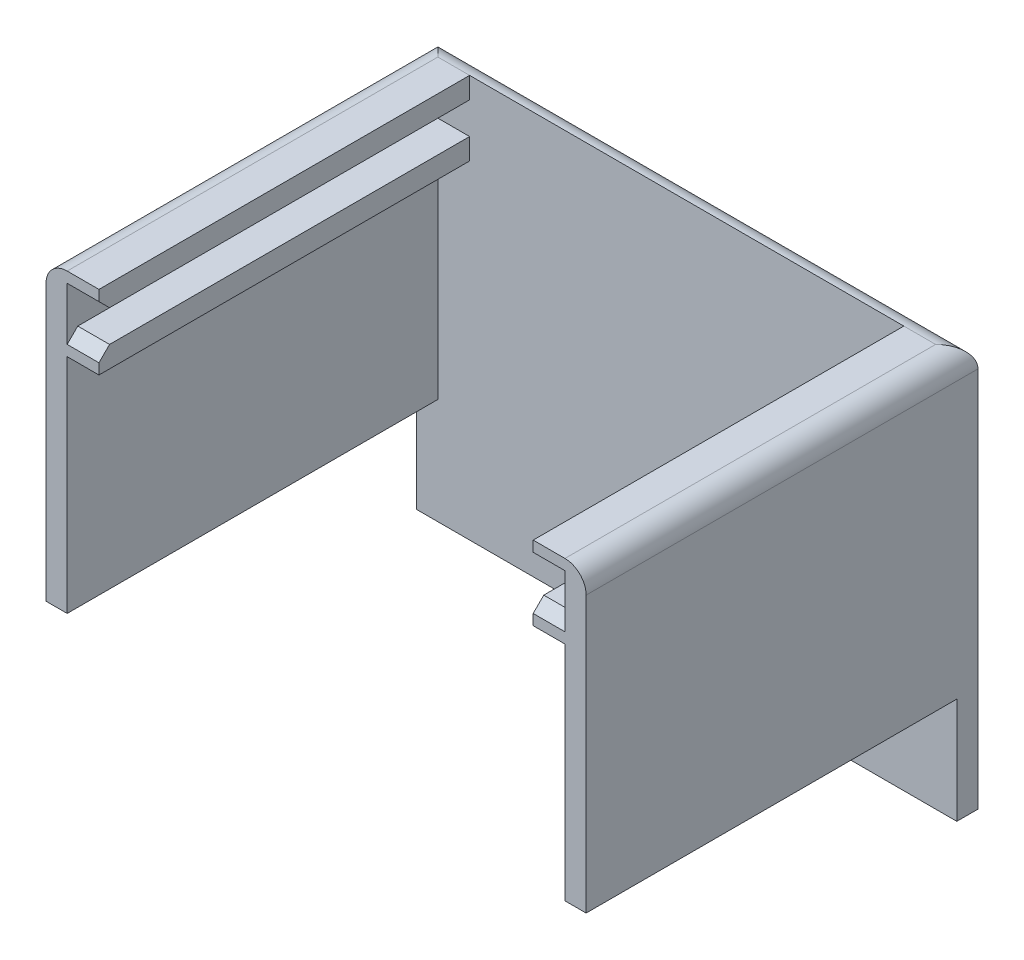
ISO-10303-21;
HEADER;
FILE_DESCRIPTION(('STEP AP214'),'2;1');
FILE_NAME('part.step','',(''),(''),'','','');
FILE_SCHEMA(('AUTOMOTIVE_DESIGN { 1 0 10303 214 1 1 1 1 }'));
ENDSEC;
DATA;
#1=APPLICATION_CONTEXT('core data for automotive mechanical design processes');
#2=APPLICATION_PROTOCOL_DEFINITION('international standard','automotive_design',2000,#1);
#3=PRODUCT_CONTEXT('',#1,'mechanical');
#4=PRODUCT('Part','Part','',(#3));
#5=PRODUCT_RELATED_PRODUCT_CATEGORY('part','',(#4));
#6=PRODUCT_DEFINITION_FORMATION('','',#4);
#7=PRODUCT_DEFINITION_CONTEXT('part definition',#1,'design');
#8=PRODUCT_DEFINITION('design','',#6,#7);
#9=PRODUCT_DEFINITION_SHAPE('','',#8);
#10=(LENGTH_UNIT() NAMED_UNIT(*) SI_UNIT(.MILLI.,.METRE.));
#11=(NAMED_UNIT(*) PLANE_ANGLE_UNIT() SI_UNIT($,.RADIAN.));
#12=(NAMED_UNIT(*) SI_UNIT($,.STERADIAN.) SOLID_ANGLE_UNIT());
#13=UNCERTAINTY_MEASURE_WITH_UNIT(LENGTH_MEASURE(1.E-05),#10,'distance_accuracy_value','');
#14=(GEOMETRIC_REPRESENTATION_CONTEXT(3) GLOBAL_UNCERTAINTY_ASSIGNED_CONTEXT((#13)) GLOBAL_UNIT_ASSIGNED_CONTEXT((#10,
#11,#12)) REPRESENTATION_CONTEXT('',''));
#15=CARTESIAN_POINT('',(0.,0.,0.));
#16=DIRECTION('',(0.,0.,1.));
#17=DIRECTION('',(1.,0.,0.));
#18=AXIS2_PLACEMENT_3D('',#15,#16,#17);
#19=CARTESIAN_POINT('',(-25.5,-2.,17.5));
#20=DIRECTION('',(0.,0.,-1.));
#21=DIRECTION('',(-1.,0.,0.));
#22=AXIS2_PLACEMENT_3D('',#19,#20,#21);
#23=PLANE('',#22);
#24=DIRECTION('',(0.,1.,0.));
#25=VECTOR('',#24,1.);
#26=CARTESIAN_POINT('',(-25.5,-2.,17.5));
#27=LINE('',#26,#25);
#28=CARTESIAN_POINT('',(-25.5,8.,17.5));
#29=VERTEX_POINT('',#28);
#30=CARTESIAN_POINT('',(-25.5,34.,17.5));
#31=VERTEX_POINT('',#30);
#32=EDGE_CURVE('E375',#29,#31,#27,.T.);
#33=ORIENTED_EDGE('',*,*,#32,.F.);
#34=DIRECTION('',(1.,0.,0.));
#35=VECTOR('',#34,1.);
#36=CARTESIAN_POINT('',(-25.5,8.,17.5));
#37=LINE('',#36,#35);
#38=CARTESIAN_POINT('',(-23.5,8.,17.5));
#39=VERTEX_POINT('',#38);
#40=EDGE_CURVE('E434',#29,#39,#37,.T.);
#41=ORIENTED_EDGE('',*,*,#40,.T.);
#42=DIRECTION('',(0.,-1.,0.));
#43=VECTOR('',#42,1.);
#44=CARTESIAN_POINT('',(-23.5,36.,17.5));
#45=LINE('',#44,#43);
#46=CARTESIAN_POINT('',(-23.5,29.,17.5));
#47=VERTEX_POINT('',#46);
#48=EDGE_CURVE('E266',#47,#39,#45,.T.);
#49=ORIENTED_EDGE('',*,*,#48,.F.);
#50=DIRECTION('',(1.,0.,0.));
#51=VECTOR('',#50,1.);
#52=CARTESIAN_POINT('',(-23.5,29.,17.5));
#53=LINE('',#52,#51);
#54=CARTESIAN_POINT('',(-20.5,29.,17.5));
#55=VERTEX_POINT('',#54);
#56=EDGE_CURVE('E403',#47,#55,#53,.T.);
#57=ORIENTED_EDGE('',*,*,#56,.T.);
#58=DIRECTION('',(0.,1.,0.));
#59=VECTOR('',#58,1.);
#60=CARTESIAN_POINT('',(-20.5,31.,17.5));
#61=LINE('',#60,#59);
#62=CARTESIAN_POINT('',(-20.5,30.,17.5));
#63=VERTEX_POINT('',#62);
#64=EDGE_CURVE('E392',#55,#63,#61,.T.);
#65=ORIENTED_EDGE('',*,*,#64,.T.);
#66=DIRECTION('',(-1.,0.,0.));
#67=VECTOR('',#66,1.);
#68=CARTESIAN_POINT('',(-23.5,30.,17.5));
#69=LINE('',#68,#67);
#70=CARTESIAN_POINT('',(-23.5,30.,17.5));
#71=VERTEX_POINT('',#70);
#72=EDGE_CURVE('E313',#63,#71,#69,.T.);
#73=ORIENTED_EDGE('',*,*,#72,.T.);
#74=CARTESIAN_POINT('',(-23.5,35.,17.5));
#75=VERTEX_POINT('',#74);
#76=EDGE_CURVE('E267',#75,#71,#45,.T.);
#77=ORIENTED_EDGE('',*,*,#76,.F.);
#78=DIRECTION('',(1.,0.,0.));
#79=VECTOR('',#78,1.);
#80=CARTESIAN_POINT('',(-25.5,35.,17.5));
#81=LINE('',#80,#79);
#82=CARTESIAN_POINT('',(-20.5,35.,17.5));
#83=VERTEX_POINT('',#82);
#84=EDGE_CURVE('E303',#75,#83,#81,.T.);
#85=ORIENTED_EDGE('',*,*,#84,.T.);
#86=DIRECTION('',(0.,-1.,0.));
#87=VECTOR('',#86,1.);
#88=CARTESIAN_POINT('',(-20.5,36.,17.5));
#89=LINE('',#88,#87);
#90=CARTESIAN_POINT('',(-20.5,36.,17.5));
#91=VERTEX_POINT('',#90);
#92=EDGE_CURVE('E250',#91,#83,#89,.T.);
#93=ORIENTED_EDGE('',*,*,#92,.F.);
#94=DIRECTION('',(-1.,0.,0.));
#95=VECTOR('',#94,1.);
#96=CARTESIAN_POINT('',(-25.5,36.,17.5));
#97=LINE('',#96,#95);
#98=CARTESIAN_POINT('',(-23.5,36.,17.5));
#99=VERTEX_POINT('',#98);
#100=EDGE_CURVE('E384',#91,#99,#97,.T.);
#101=ORIENTED_EDGE('',*,*,#100,.T.);
#102=CARTESIAN_POINT('',(-23.5,34.,17.5));
#103=DIRECTION('',(0.,0.,-1.));
#104=DIRECTION('',(-1.,0.,0.));
#105=AXIS2_PLACEMENT_3D('',#102,#103,#104);
#106=CIRCLE('',#105,2.);
#107=EDGE_CURVE('E294',#99,#31,#106,.F.);
#108=ORIENTED_EDGE('',*,*,#107,.T.);
#109=EDGE_LOOP('',(#33,#41,#49,#57,#65,#73,#77,#85,#93,#101,#108));
#110=FACE_BOUND('',#109,.T.);
#111=ADVANCED_FACE('F33',(#110),#23,.F.);
#112=CARTESIAN_POINT('',(0.,36.,0.));
#113=DIRECTION('',(0.,-1.,0.));
#114=DIRECTION('',(0.,0.,-1.));
#115=AXIS2_PLACEMENT_3D('',#112,#113,#114);
#116=PLANE('',#115);
#117=CARTESIAN_POINT('',(23.5,36.,17.5));
#118=VERTEX_POINT('',#117);
#119=CARTESIAN_POINT('',(20.5,36.,17.5));
#120=VERTEX_POINT('',#119);
#121=EDGE_CURVE('E380',#118,#120,#97,.T.);
#122=ORIENTED_EDGE('',*,*,#121,.F.);
#123=DIRECTION('',(0.,0.,-1.));
#124=VECTOR('',#123,1.);
#125=CARTESIAN_POINT('',(23.5,36.,0.));
#126=LINE('',#125,#124);
#127=CARTESIAN_POINT('',(23.5,36.,-17.5));
#128=VERTEX_POINT('',#127);
#129=EDGE_CURVE('E288',#118,#128,#126,.T.);
#130=ORIENTED_EDGE('',*,*,#129,.T.);
#131=DIRECTION('',(-1.,0.,0.));
#132=VECTOR('',#131,1.);
#133=CARTESIAN_POINT('',(0.,36.,-17.5));
#134=LINE('',#133,#132);
#135=CARTESIAN_POINT('',(20.5,36.,-17.5));
#136=VERTEX_POINT('',#135);
#137=EDGE_CURVE('E286',#128,#136,#134,.T.);
#138=ORIENTED_EDGE('',*,*,#137,.T.);
#139=DIRECTION('',(0.,0.,1.));
#140=VECTOR('',#139,1.);
#141=CARTESIAN_POINT('',(20.5,36.,19.5));
#142=LINE('',#141,#140);
#143=EDGE_CURVE('E372',#136,#120,#142,.T.);
#144=ORIENTED_EDGE('',*,*,#143,.T.);
#145=EDGE_LOOP('',(#122,#130,#138,#144));
#146=FACE_BOUND('',#145,.T.);
#147=ADVANCED_FACE('F529',(#146),#116,.F.);
#148=CARTESIAN_POINT('',(23.5,36.,-17.5));
#149=DIRECTION('',(-1.,0.,0.));
#150=DIRECTION('',(0.,0.,1.));
#151=AXIS2_PLACEMENT_3D('',#148,#149,#150);
#152=PLANE('',#151);
#153=DIRECTION('',(0.,0.,-1.));
#154=VECTOR('',#153,1.);
#155=CARTESIAN_POINT('',(23.5,8.,-17.5));
#156=LINE('',#155,#154);
#157=CARTESIAN_POINT('',(23.5,8.,17.5));
#158=VERTEX_POINT('',#157);
#159=CARTESIAN_POINT('',(23.5,8.,-17.5));
#160=VERTEX_POINT('',#159);
#161=EDGE_CURVE('E307',#158,#160,#156,.T.);
#162=ORIENTED_EDGE('',*,*,#161,.F.);
#163=DIRECTION('',(0.,-1.,0.));
#164=VECTOR('',#163,1.);
#165=CARTESIAN_POINT('',(23.5,36.,17.5));
#166=LINE('',#165,#164);
#167=CARTESIAN_POINT('',(23.5,29.,17.5));
#168=VERTEX_POINT('',#167);
#169=EDGE_CURVE('E263',#168,#158,#166,.T.);
#170=ORIENTED_EDGE('',*,*,#169,.F.);
#171=DIRECTION('',(0.,0.,1.));
#172=VECTOR('',#171,1.);
#173=CARTESIAN_POINT('',(23.5,29.,-21.105551275464));
#174=LINE('',#173,#172);
#175=CARTESIAN_POINT('',(23.5,29.,-17.5));
#176=VERTEX_POINT('',#175);
#177=EDGE_CURVE('E422',#176,#168,#174,.T.);
#178=ORIENTED_EDGE('',*,*,#177,.F.);
#179=DIRECTION('',(0.,-1.,0.));
#180=VECTOR('',#179,1.);
#181=CARTESIAN_POINT('',(23.5,36.,-17.5));
#182=LINE('',#181,#180);
#183=EDGE_CURVE('E259',#176,#160,#182,.T.);
#184=ORIENTED_EDGE('',*,*,#183,.T.);
#185=EDGE_LOOP('',(#162,#170,#178,#184));
#186=FACE_BOUND('',#185,.T.);
#187=ADVANCED_FACE('F464',(#186),#152,.T.);
#188=CARTESIAN_POINT('',(-23.5,36.,-17.5));
#189=DIRECTION('',(1.,0.,0.));
#190=DIRECTION('',(0.,0.,-1.));
#191=AXIS2_PLACEMENT_3D('',#188,#189,#190);
#192=PLANE('',#191);
#193=DIRECTION('',(0.,0.,1.));
#194=VECTOR('',#193,1.);
#195=CARTESIAN_POINT('',(-23.5,31.,-21.105551275464));
#196=LINE('',#195,#194);
#197=CARTESIAN_POINT('',(-23.5,31.,-17.5));
#198=VERTEX_POINT('',#197);
#199=CARTESIAN_POINT('',(-23.5,31.,16.5));
#200=VERTEX_POINT('',#199);
#201=EDGE_CURVE('E397',#198,#200,#196,.T.);
#202=ORIENTED_EDGE('',*,*,#201,.F.);
#203=DIRECTION('',(0.,-1.,0.));
#204=VECTOR('',#203,1.);
#205=CARTESIAN_POINT('',(-23.5,36.,-17.5));
#206=LINE('',#205,#204);
#207=CARTESIAN_POINT('',(-23.5,34.,-17.5));
#208=VERTEX_POINT('',#207);
#209=EDGE_CURVE('E256',#208,#198,#206,.T.);
#210=ORIENTED_EDGE('',*,*,#209,.F.);
#211=DIRECTION('',(0.,0.,1.));
#212=VECTOR('',#211,1.);
#213=CARTESIAN_POINT('',(-23.5,34.,-17.5));
#214=LINE('',#213,#212);
#215=CARTESIAN_POINT('',(-23.5,34.,16.5));
#216=VERTEX_POINT('',#215);
#217=EDGE_CURVE('E350',#208,#216,#214,.T.);
#218=ORIENTED_EDGE('',*,*,#217,.T.);
#219=DIRECTION('',(0.,-0.707106781186545,-0.70710678118655));
#220=VECTOR('',#219,1.);
#221=CARTESIAN_POINT('',(-23.5,35.,17.5));
#222=LINE('',#221,#220);
#223=EDGE_CURVE('E41',#216,#75,#222,.F.);
#224=ORIENTED_EDGE('',*,*,#223,.T.);
#225=ORIENTED_EDGE('',*,*,#76,.T.);
#226=DIRECTION('',(0.,0.707106781186544,-0.707106781186551));
#227=VECTOR('',#226,1.);
#228=CARTESIAN_POINT('',(-23.5,30.,17.5));
#229=LINE('',#228,#227);
#230=EDGE_CURVE('E342',#71,#200,#229,.T.);
#231=ORIENTED_EDGE('',*,*,#230,.T.);
#232=EDGE_LOOP('',(#202,#210,#218,#224,#225,#231));
#233=FACE_BOUND('',#232,.T.);
#234=ADVANCED_FACE('F347',(#233),#192,.T.);
#235=DIRECTION('',(0.,0.,1.));
#236=VECTOR('',#235,1.);
#237=CARTESIAN_POINT('',(23.5,31.,-21.105551275464));
#238=LINE('',#237,#236);
#239=CARTESIAN_POINT('',(23.5,31.,-17.5));
#240=VERTEX_POINT('',#239);
#241=CARTESIAN_POINT('',(23.5,31.,16.5));
#242=VERTEX_POINT('',#241);
#243=EDGE_CURVE('E412',#240,#242,#238,.T.);
#244=ORIENTED_EDGE('',*,*,#243,.T.);
#245=DIRECTION('',(0.,-0.707106781186544,0.707106781186551));
#246=VECTOR('',#245,1.);
#247=CARTESIAN_POINT('',(23.5,30.,17.5));
#248=LINE('',#247,#246);
#249=CARTESIAN_POINT('',(23.5,30.,17.5));
#250=VERTEX_POINT('',#249);
#251=EDGE_CURVE('E337',#242,#250,#248,.T.);
#252=ORIENTED_EDGE('',*,*,#251,.T.);
#253=CARTESIAN_POINT('',(23.5,35.,17.5));
#254=VERTEX_POINT('',#253);
#255=EDGE_CURVE('E264',#254,#250,#166,.T.);
#256=ORIENTED_EDGE('',*,*,#255,.F.);
#257=DIRECTION('',(0.,0.707106781186543,0.707106781186552));
#258=VECTOR('',#257,1.);
#259=CARTESIAN_POINT('',(23.5,35.,17.5));
#260=LINE('',#259,#258);
#261=CARTESIAN_POINT('',(23.5,34.,16.5));
#262=VERTEX_POINT('',#261);
#263=EDGE_CURVE('E340',#254,#262,#260,.F.);
#264=ORIENTED_EDGE('',*,*,#263,.T.);
#265=DIRECTION('',(0.,0.,-1.));
#266=VECTOR('',#265,1.);
#267=CARTESIAN_POINT('',(23.5,34.,-17.5));
#268=LINE('',#267,#266);
#269=CARTESIAN_POINT('',(23.5,34.,-17.5));
#270=VERTEX_POINT('',#269);
#271=EDGE_CURVE('E369',#262,#270,#268,.T.);
#272=ORIENTED_EDGE('',*,*,#271,.T.);
#273=EDGE_CURVE('E260',#270,#240,#182,.T.);
#274=ORIENTED_EDGE('',*,*,#273,.T.);
#275=EDGE_LOOP('',(#244,#252,#256,#264,#272,#274));
#276=FACE_BOUND('',#275,.T.);
#277=ADVANCED_FACE('F481',(#276),#152,.T.);
#278=DIRECTION('',(0.,0.,1.));
#279=VECTOR('',#278,1.);
#280=CARTESIAN_POINT('',(-23.5,8.,-17.5));
#281=LINE('',#280,#279);
#282=CARTESIAN_POINT('',(-23.5,8.,-17.5));
#283=VERTEX_POINT('',#282);
#284=EDGE_CURVE('E433',#283,#39,#281,.T.);
#285=ORIENTED_EDGE('',*,*,#284,.F.);
#286=CARTESIAN_POINT('',(-23.5,29.,-17.5));
#287=VERTEX_POINT('',#286);
#288=EDGE_CURVE('E255',#287,#283,#206,.T.);
#289=ORIENTED_EDGE('',*,*,#288,.F.);
#290=DIRECTION('',(0.,0.,1.));
#291=VECTOR('',#290,1.);
#292=CARTESIAN_POINT('',(-23.5,29.,-21.105551275464));
#293=LINE('',#292,#291);
#294=EDGE_CURVE('E388',#287,#47,#293,.T.);
#295=ORIENTED_EDGE('',*,*,#294,.T.);
#296=ORIENTED_EDGE('',*,*,#48,.T.);
#297=EDGE_LOOP('',(#285,#289,#295,#296));
#298=FACE_BOUND('',#297,.T.);
#299=ADVANCED_FACE('F563',(#298),#192,.T.);
#300=DIRECTION('',(0.,0.,-1.));
#301=VECTOR('',#300,1.);
#302=CARTESIAN_POINT('',(-20.5,36.,-19.5));
#303=LINE('',#302,#301);
#304=CARTESIAN_POINT('',(-20.5,36.,-17.5));
#305=VERTEX_POINT('',#304);
#306=EDGE_CURVE('E361',#91,#305,#303,.T.);
#307=ORIENTED_EDGE('',*,*,#306,.T.);
#308=DIRECTION('',(-1.,0.,0.));
#309=VECTOR('',#308,1.);
#310=CARTESIAN_POINT('',(0.,36.,-17.5));
#311=LINE('',#310,#309);
#312=CARTESIAN_POINT('',(-23.5,36.,-17.5));
#313=VERTEX_POINT('',#312);
#314=EDGE_CURVE('E284',#305,#313,#311,.T.);
#315=ORIENTED_EDGE('',*,*,#314,.T.);
#316=DIRECTION('',(0.,0.,1.));
#317=VECTOR('',#316,1.);
#318=CARTESIAN_POINT('',(-23.5,36.,0.));
#319=LINE('',#318,#317);
#320=EDGE_CURVE('E282',#313,#99,#319,.T.);
#321=ORIENTED_EDGE('',*,*,#320,.T.);
#322=ORIENTED_EDGE('',*,*,#100,.F.);
#323=EDGE_LOOP('',(#307,#315,#321,#322));
#324=FACE_BOUND('',#323,.T.);
#325=ADVANCED_FACE('F510',(#324),#116,.F.);
#326=CARTESIAN_POINT('',(25.5,36.,-19.5));
#327=DIRECTION('',(-1.,0.,0.));
#328=DIRECTION('',(0.,0.,1.));
#329=AXIS2_PLACEMENT_3D('',#326,#327,#328);
#330=PLANE('',#329);
#331=DIRECTION('',(0.,1.,0.));
#332=VECTOR('',#331,1.);
#333=CARTESIAN_POINT('',(25.5,-2.,17.5));
#334=LINE('',#333,#332);
#335=CARTESIAN_POINT('',(25.5,8.,17.5));
#336=VERTEX_POINT('',#335);
#337=CARTESIAN_POINT('',(25.5,34.,17.5));
#338=VERTEX_POINT('',#337);
#339=EDGE_CURVE('E378',#336,#338,#334,.T.);
#340=ORIENTED_EDGE('',*,*,#339,.F.);
#341=DIRECTION('',(0.,0.,1.));
#342=VECTOR('',#341,1.);
#343=CARTESIAN_POINT('',(25.5,8.,17.5));
#344=LINE('',#343,#342);
#345=CARTESIAN_POINT('',(25.5,8.,-17.5));
#346=VERTEX_POINT('',#345);
#347=EDGE_CURVE('E48',#346,#336,#344,.T.);
#348=ORIENTED_EDGE('',*,*,#347,.F.);
#349=DIRECTION('',(0.,1.,0.));
#350=VECTOR('',#349,1.);
#351=CARTESIAN_POINT('',(25.5,-2.,-17.5));
#352=LINE('',#351,#350);
#353=CARTESIAN_POINT('',(25.5,-2.,-17.5));
#354=VERTEX_POINT('',#353);
#355=EDGE_CURVE('E440',#354,#346,#352,.T.);
#356=ORIENTED_EDGE('',*,*,#355,.F.);
#357=DIRECTION('',(0.,0.,1.));
#358=VECTOR('',#357,1.);
#359=CARTESIAN_POINT('',(25.5,-2.,-19.5));
#360=LINE('',#359,#358);
#361=CARTESIAN_POINT('',(25.5,-2.,-19.5));
#362=VERTEX_POINT('',#361);
#363=EDGE_CURVE('E239',#362,#354,#360,.T.);
#364=ORIENTED_EDGE('',*,*,#363,.F.);
#365=DIRECTION('',(0.,-1.,0.));
#366=VECTOR('',#365,1.);
#367=CARTESIAN_POINT('',(25.5,36.,-19.5));
#368=LINE('',#367,#366);
#369=CARTESIAN_POINT('',(25.5,34.,-19.5));
#370=VERTEX_POINT('',#369);
#371=EDGE_CURVE('E270',#370,#362,#368,.T.);
#372=ORIENTED_EDGE('',*,*,#371,.F.);
#373=DIRECTION('',(0.,0.,-1.));
#374=VECTOR('',#373,1.);
#375=CARTESIAN_POINT('',(25.5,34.,-19.5));
#376=LINE('',#375,#374);
#377=EDGE_CURVE('E291',#370,#338,#376,.F.);
#378=ORIENTED_EDGE('',*,*,#377,.T.);
#379=EDGE_LOOP('',(#340,#348,#356,#364,#372,#378));
#380=FACE_BOUND('',#379,.T.);
#381=ADVANCED_FACE('F456',(#380),#330,.F.);
#382=CARTESIAN_POINT('',(25.5,36.,-19.5));
#383=DIRECTION('',(0.,0.,1.));
#384=DIRECTION('',(1.,0.,0.));
#385=AXIS2_PLACEMENT_3D('',#382,#383,#384);
#386=PLANE('',#385);
#387=DIRECTION('',(0.,-1.,0.));
#388=VECTOR('',#387,1.);
#389=CARTESIAN_POINT('',(-25.5,36.,-19.5));
#390=LINE('',#389,#388);
#391=CARTESIAN_POINT('',(-25.5,34.,-19.5));
#392=VERTEX_POINT('',#391);
#393=CARTESIAN_POINT('',(-25.5,-2.,-19.5));
#394=VERTEX_POINT('',#393);
#395=EDGE_CURVE('E244',#392,#394,#390,.T.);
#396=ORIENTED_EDGE('',*,*,#395,.F.);
#397=DIRECTION('',(-1.,0.,0.));
#398=VECTOR('',#397,1.);
#399=CARTESIAN_POINT('',(25.5,34.,-19.5));
#400=LINE('',#399,#398);
#401=EDGE_CURVE('E299',#392,#370,#400,.F.);
#402=ORIENTED_EDGE('',*,*,#401,.T.);
#403=ORIENTED_EDGE('',*,*,#371,.T.);
#404=DIRECTION('',(1.,0.,0.));
#405=VECTOR('',#404,1.);
#406=CARTESIAN_POINT('',(-25.5,-2.,-19.5));
#407=LINE('',#406,#405);
#408=EDGE_CURVE('E246',#394,#362,#407,.T.);
#409=ORIENTED_EDGE('',*,*,#408,.F.);
#410=EDGE_LOOP('',(#396,#402,#403,#409));
#411=FACE_BOUND('',#410,.T.);
#412=ADVANCED_FACE('F452',(#411),#386,.F.);
#413=CARTESIAN_POINT('',(-25.5,36.,-19.5));
#414=DIRECTION('',(1.,0.,0.));
#415=DIRECTION('',(0.,0.,-1.));
#416=AXIS2_PLACEMENT_3D('',#413,#414,#415);
#417=PLANE('',#416);
#418=DIRECTION('',(0.,1.,0.));
#419=VECTOR('',#418,1.);
#420=CARTESIAN_POINT('',(-25.5,-2.,-17.5));
#421=LINE('',#420,#419);
#422=CARTESIAN_POINT('',(-25.5,-2.,-17.5));
#423=VERTEX_POINT('',#422);
#424=CARTESIAN_POINT('',(-25.5,8.,-17.5));
#425=VERTEX_POINT('',#424);
#426=EDGE_CURVE('E218',#423,#425,#421,.T.);
#427=ORIENTED_EDGE('',*,*,#426,.T.);
#428=DIRECTION('',(0.,0.,1.));
#429=VECTOR('',#428,1.);
#430=CARTESIAN_POINT('',(-25.5,8.,17.5));
#431=LINE('',#430,#429);
#432=EDGE_CURVE('E230',#425,#29,#431,.T.);
#433=ORIENTED_EDGE('',*,*,#432,.T.);
#434=ORIENTED_EDGE('',*,*,#32,.T.);
#435=DIRECTION('',(0.,0.,1.));
#436=VECTOR('',#435,1.);
#437=CARTESIAN_POINT('',(-25.5,34.,-19.5));
#438=LINE('',#437,#436);
#439=EDGE_CURVE('E301',#31,#392,#438,.F.);
#440=ORIENTED_EDGE('',*,*,#439,.T.);
#441=ORIENTED_EDGE('',*,*,#395,.T.);
#442=DIRECTION('',(0.,0.,-1.));
#443=VECTOR('',#442,1.);
#444=CARTESIAN_POINT('',(-25.5,-2.,-19.5));
#445=LINE('',#444,#443);
#446=EDGE_CURVE('E236',#423,#394,#445,.T.);
#447=ORIENTED_EDGE('',*,*,#446,.F.);
#448=EDGE_LOOP('',(#427,#433,#434,#440,#441,#447));
#449=FACE_BOUND('',#448,.T.);
#450=ADVANCED_FACE('F242',(#449),#417,.F.);
#451=CARTESIAN_POINT('',(23.5,36.,-17.5));
#452=DIRECTION('',(0.,0.,1.));
#453=DIRECTION('',(1.,0.,0.));
#454=AXIS2_PLACEMENT_3D('',#451,#452,#453);
#455=PLANE('',#454);
#456=ORIENTED_EDGE('',*,*,#288,.T.);
#457=DIRECTION('',(1.,0.,0.));
#458=VECTOR('',#457,1.);
#459=CARTESIAN_POINT('',(-25.5,8.,-17.5));
#460=LINE('',#459,#458);
#461=EDGE_CURVE('E225',#425,#283,#460,.T.);
#462=ORIENTED_EDGE('',*,*,#461,.F.);
#463=ORIENTED_EDGE('',*,*,#426,.F.);
#464=DIRECTION('',(1.,0.,0.));
#465=VECTOR('',#464,1.);
#466=CARTESIAN_POINT('',(-25.5,-2.,-17.5));
#467=LINE('',#466,#465);
#468=EDGE_CURVE('E223',#423,#354,#467,.T.);
#469=ORIENTED_EDGE('',*,*,#468,.T.);
#470=ORIENTED_EDGE('',*,*,#355,.T.);
#471=EDGE_CURVE('E240',#160,#346,#460,.T.);
#472=ORIENTED_EDGE('',*,*,#471,.F.);
#473=ORIENTED_EDGE('',*,*,#183,.F.);
#474=DIRECTION('',(-1.,0.,0.));
#475=VECTOR('',#474,1.);
#476=CARTESIAN_POINT('',(20.5,29.,-17.5));
#477=LINE('',#476,#475);
#478=CARTESIAN_POINT('',(20.5,29.,-17.5));
#479=VERTEX_POINT('',#478);
#480=EDGE_CURVE('E411',#176,#479,#477,.T.);
#481=ORIENTED_EDGE('',*,*,#480,.T.);
#482=DIRECTION('',(0.,1.,0.));
#483=VECTOR('',#482,1.);
#484=CARTESIAN_POINT('',(20.5,31.,-17.5));
#485=LINE('',#484,#483);
#486=CARTESIAN_POINT('',(20.5,31.,-17.5));
#487=VERTEX_POINT('',#486);
#488=EDGE_CURVE('E425',#479,#487,#485,.T.);
#489=ORIENTED_EDGE('',*,*,#488,.T.);
#490=DIRECTION('',(1.,0.,0.));
#491=VECTOR('',#490,1.);
#492=CARTESIAN_POINT('',(20.5,31.,-17.5));
#493=LINE('',#492,#491);
#494=EDGE_CURVE('E406',#487,#240,#493,.T.);
#495=ORIENTED_EDGE('',*,*,#494,.T.);
#496=ORIENTED_EDGE('',*,*,#273,.F.);
#497=DIRECTION('',(-1.,0.,0.));
#498=VECTOR('',#497,1.);
#499=CARTESIAN_POINT('',(23.5,34.,-17.5));
#500=LINE('',#499,#498);
#501=CARTESIAN_POINT('',(20.5,34.,-17.5));
#502=VERTEX_POINT('',#501);
#503=EDGE_CURVE('E277',#270,#502,#500,.T.);
#504=ORIENTED_EDGE('',*,*,#503,.T.);
#505=DIRECTION('',(0.,-1.,0.));
#506=VECTOR('',#505,1.);
#507=CARTESIAN_POINT('',(20.5,36.,-17.5));
#508=LINE('',#507,#506);
#509=EDGE_CURVE('E279',#136,#502,#508,.T.);
#510=ORIENTED_EDGE('',*,*,#509,.F.);
#511=DIRECTION('',(-1.,0.,0.));
#512=VECTOR('',#511,1.);
#513=CARTESIAN_POINT('',(23.5,36.,-17.5));
#514=LINE('',#513,#512);
#515=EDGE_CURVE('E248',#136,#305,#514,.T.);
#516=ORIENTED_EDGE('',*,*,#515,.T.);
#517=DIRECTION('',(0.,1.,0.));
#518=VECTOR('',#517,1.);
#519=CARTESIAN_POINT('',(-20.5,36.,-17.5));
#520=LINE('',#519,#518);
#521=CARTESIAN_POINT('',(-20.5,34.,-17.5));
#522=VERTEX_POINT('',#521);
#523=EDGE_CURVE('E274',#522,#305,#520,.T.);
#524=ORIENTED_EDGE('',*,*,#523,.F.);
#525=DIRECTION('',(-1.,0.,0.));
#526=VECTOR('',#525,1.);
#527=CARTESIAN_POINT('',(23.5,34.,-17.5));
#528=LINE('',#527,#526);
#529=EDGE_CURVE('E272',#522,#208,#528,.T.);
#530=ORIENTED_EDGE('',*,*,#529,.T.);
#531=ORIENTED_EDGE('',*,*,#209,.T.);
#532=DIRECTION('',(1.,0.,0.));
#533=VECTOR('',#532,1.);
#534=CARTESIAN_POINT('',(-23.5,31.,-17.5));
#535=LINE('',#534,#533);
#536=CARTESIAN_POINT('',(-20.5,31.,-17.5));
#537=VERTEX_POINT('',#536);
#538=EDGE_CURVE('E387',#198,#537,#535,.T.);
#539=ORIENTED_EDGE('',*,*,#538,.T.);
#540=DIRECTION('',(0.,-1.,0.));
#541=VECTOR('',#540,1.);
#542=CARTESIAN_POINT('',(-20.5,31.,-17.5));
#543=LINE('',#542,#541);
#544=CARTESIAN_POINT('',(-20.5,29.,-17.5));
#545=VERTEX_POINT('',#544);
#546=EDGE_CURVE('E400',#537,#545,#543,.T.);
#547=ORIENTED_EDGE('',*,*,#546,.T.);
#548=DIRECTION('',(-1.,0.,0.));
#549=VECTOR('',#548,1.);
#550=CARTESIAN_POINT('',(-23.5,29.,-17.5));
#551=LINE('',#550,#549);
#552=EDGE_CURVE('E385',#545,#287,#551,.T.);
#553=ORIENTED_EDGE('',*,*,#552,.T.);
#554=EDGE_LOOP('',(#456,#462,#463,#469,#470,#472,#473,#481,#489,#495,#496,#504,#510,#516,#524,
#530,#531,#539,#547,#553));
#555=FACE_BOUND('',#554,.T.);
#556=ADVANCED_FACE('F221',(#555),#455,.T.);
#557=CARTESIAN_POINT('',(0.,-2.,0.));
#558=DIRECTION('',(0.,1.,0.));
#559=DIRECTION('',(0.,0.,1.));
#560=AXIS2_PLACEMENT_3D('',#557,#558,#559);
#561=PLANE('',#560);
#562=ORIENTED_EDGE('',*,*,#363,.T.);
#563=ORIENTED_EDGE('',*,*,#468,.F.);
#564=ORIENTED_EDGE('',*,*,#446,.T.);
#565=ORIENTED_EDGE('',*,*,#408,.T.);
#566=EDGE_LOOP('',(#562,#563,#564,#565));
#567=FACE_BOUND('',#566,.T.);
#568=ADVANCED_FACE('F234',(#567),#561,.F.);
#569=CARTESIAN_POINT('',(-20.5,34.,-19.5));
#570=DIRECTION('',(1.,0.,0.));
#571=DIRECTION('',(0.,0.,-1.));
#572=AXIS2_PLACEMENT_3D('',#569,#570,#571);
#573=PLANE('',#572);
#574=ORIENTED_EDGE('',*,*,#92,.T.);
#575=DIRECTION('',(0.,0.707106781186545,0.70710678118655));
#576=VECTOR('',#575,1.);
#577=CARTESIAN_POINT('',(-20.5,16.,-1.50000000000012));
#578=LINE('',#577,#576);
#579=CARTESIAN_POINT('',(-20.5,34.,16.5));
#580=VERTEX_POINT('',#579);
#581=EDGE_CURVE('E334',#83,#580,#578,.F.);
#582=ORIENTED_EDGE('',*,*,#581,.T.);
#583=DIRECTION('',(0.,0.,-1.));
#584=VECTOR('',#583,1.);
#585=CARTESIAN_POINT('',(-20.5,34.,-19.5));
#586=LINE('',#585,#584);
#587=EDGE_CURVE('E362',#580,#522,#586,.T.);
#588=ORIENTED_EDGE('',*,*,#587,.T.);
#589=ORIENTED_EDGE('',*,*,#523,.T.);
#590=ORIENTED_EDGE('',*,*,#306,.F.);
#591=EDGE_LOOP('',(#574,#582,#588,#589,#590));
#592=FACE_BOUND('',#591,.T.);
#593=ADVANCED_FACE('F359',(#592),#573,.T.);
#594=CARTESIAN_POINT('',(0.,34.,0.));
#595=DIRECTION('',(0.,1.,0.));
#596=DIRECTION('',(0.,0.,1.));
#597=AXIS2_PLACEMENT_3D('',#594,#595,#596);
#598=PLANE('',#597);
#599=ORIENTED_EDGE('',*,*,#587,.F.);
#600=DIRECTION('',(-1.,0.,0.));
#601=VECTOR('',#600,1.);
#602=CARTESIAN_POINT('',(0.,34.,16.5));
#603=LINE('',#602,#601);
#604=EDGE_CURVE('E55',#580,#216,#603,.T.);
#605=ORIENTED_EDGE('',*,*,#604,.T.);
#606=ORIENTED_EDGE('',*,*,#217,.F.);
#607=ORIENTED_EDGE('',*,*,#529,.F.);
#608=EDGE_LOOP('',(#599,#605,#606,#607));
#609=FACE_BOUND('',#608,.T.);
#610=ADVANCED_FACE('F550',(#609),#598,.F.);
#611=CARTESIAN_POINT('',(20.5,34.,19.5));
#612=DIRECTION('',(-1.,0.,0.));
#613=DIRECTION('',(0.,0.,1.));
#614=AXIS2_PLACEMENT_3D('',#611,#612,#613);
#615=PLANE('',#614);
#616=DIRECTION('',(0.,0.,1.));
#617=VECTOR('',#616,1.);
#618=CARTESIAN_POINT('',(20.5,34.,19.5));
#619=LINE('',#618,#617);
#620=CARTESIAN_POINT('',(20.5,34.,16.5));
#621=VERTEX_POINT('',#620);
#622=EDGE_CURVE('E371',#502,#621,#619,.T.);
#623=ORIENTED_EDGE('',*,*,#622,.T.);
#624=DIRECTION('',(0.,-0.707106781186543,-0.707106781186552));
#625=VECTOR('',#624,1.);
#626=CARTESIAN_POINT('',(20.5,35.5,18.));
#627=LINE('',#626,#625);
#628=CARTESIAN_POINT('',(20.5,35.,17.5));
#629=VERTEX_POINT('',#628);
#630=EDGE_CURVE('E328',#621,#629,#627,.F.);
#631=ORIENTED_EDGE('',*,*,#630,.T.);
#632=DIRECTION('',(0.,1.,0.));
#633=VECTOR('',#632,1.);
#634=CARTESIAN_POINT('',(20.5,36.,17.5));
#635=LINE('',#634,#633);
#636=EDGE_CURVE('E366',#629,#120,#635,.T.);
#637=ORIENTED_EDGE('',*,*,#636,.T.);
#638=ORIENTED_EDGE('',*,*,#143,.F.);
#639=ORIENTED_EDGE('',*,*,#509,.T.);
#640=EDGE_LOOP('',(#623,#631,#637,#638,#639));
#641=FACE_BOUND('',#640,.T.);
#642=ADVANCED_FACE('F500',(#641),#615,.T.);
#643=CARTESIAN_POINT('',(0.,34.,0.));
#644=DIRECTION('',(0.,1.,0.));
#645=DIRECTION('',(0.,0.,1.));
#646=AXIS2_PLACEMENT_3D('',#643,#644,#645);
#647=PLANE('',#646);
#648=ORIENTED_EDGE('',*,*,#271,.F.);
#649=DIRECTION('',(-1.,0.,0.));
#650=VECTOR('',#649,1.);
#651=CARTESIAN_POINT('',(0.,34.,16.5));
#652=LINE('',#651,#650);
#653=EDGE_CURVE('E326',#262,#621,#652,.T.);
#654=ORIENTED_EDGE('',*,*,#653,.T.);
#655=ORIENTED_EDGE('',*,*,#622,.F.);
#656=ORIENTED_EDGE('',*,*,#503,.F.);
#657=EDGE_LOOP('',(#648,#654,#655,#656));
#658=FACE_BOUND('',#657,.T.);
#659=ADVANCED_FACE('F497',(#658),#647,.F.);
#660=ORIENTED_EDGE('',*,*,#169,.T.);
#661=DIRECTION('',(1.,0.,0.));
#662=VECTOR('',#661,1.);
#663=CARTESIAN_POINT('',(-25.5,8.,17.5));
#664=LINE('',#663,#662);
#665=EDGE_CURVE('E11',#158,#336,#664,.T.);
#666=ORIENTED_EDGE('',*,*,#665,.T.);
#667=ORIENTED_EDGE('',*,*,#339,.T.);
#668=CARTESIAN_POINT('',(23.5,34.,17.5));
#669=DIRECTION('',(0.,0.,-1.));
#670=DIRECTION('',(-1.,0.,0.));
#671=AXIS2_PLACEMENT_3D('',#668,#669,#670);
#672=CIRCLE('',#671,2.);
#673=EDGE_CURVE('E297',#338,#118,#672,.F.);
#674=ORIENTED_EDGE('',*,*,#673,.T.);
#675=ORIENTED_EDGE('',*,*,#121,.T.);
#676=ORIENTED_EDGE('',*,*,#636,.F.);
#677=DIRECTION('',(1.,0.,0.));
#678=VECTOR('',#677,1.);
#679=CARTESIAN_POINT('',(-25.5,35.,17.5));
#680=LINE('',#679,#678);
#681=EDGE_CURVE('E316',#629,#254,#680,.T.);
#682=ORIENTED_EDGE('',*,*,#681,.T.);
#683=ORIENTED_EDGE('',*,*,#255,.T.);
#684=DIRECTION('',(-1.,0.,0.));
#685=VECTOR('',#684,1.);
#686=CARTESIAN_POINT('',(20.5,30.,17.5));
#687=LINE('',#686,#685);
#688=CARTESIAN_POINT('',(20.5,30.,17.5));
#689=VERTEX_POINT('',#688);
#690=EDGE_CURVE('E319',#250,#689,#687,.T.);
#691=ORIENTED_EDGE('',*,*,#690,.T.);
#692=DIRECTION('',(0.,-1.,0.));
#693=VECTOR('',#692,1.);
#694=CARTESIAN_POINT('',(20.5,31.,17.5));
#695=LINE('',#694,#693);
#696=CARTESIAN_POINT('',(20.5,29.,17.5));
#697=VERTEX_POINT('',#696);
#698=EDGE_CURVE('E310',#689,#697,#695,.T.);
#699=ORIENTED_EDGE('',*,*,#698,.T.);
#700=DIRECTION('',(1.,0.,0.));
#701=VECTOR('',#700,1.);
#702=CARTESIAN_POINT('',(20.5,29.,17.5));
#703=LINE('',#702,#701);
#704=EDGE_CURVE('E416',#697,#168,#703,.T.);
#705=ORIENTED_EDGE('',*,*,#704,.T.);
#706=EDGE_LOOP('',(#660,#666,#667,#674,#675,#676,#682,#683,#691,#699,#705));
#707=FACE_BOUND('',#706,.T.);
#708=ADVANCED_FACE('F486',(#707),#23,.F.);
#709=CARTESIAN_POINT('',(-23.5,31.,-21.105551275464));
#710=DIRECTION('',(0.,1.,0.));
#711=DIRECTION('',(0.,0.,1.));
#712=AXIS2_PLACEMENT_3D('',#709,#710,#711);
#713=PLANE('',#712);
#714=ORIENTED_EDGE('',*,*,#201,.T.);
#715=DIRECTION('',(1.,0.,0.));
#716=VECTOR('',#715,1.);
#717=CARTESIAN_POINT('',(-20.5,31.,16.5));
#718=LINE('',#717,#716);
#719=CARTESIAN_POINT('',(-20.5,31.,16.5));
#720=VERTEX_POINT('',#719);
#721=EDGE_CURVE('E330',#200,#720,#718,.T.);
#722=ORIENTED_EDGE('',*,*,#721,.T.);
#723=DIRECTION('',(0.,0.,1.));
#724=VECTOR('',#723,1.);
#725=CARTESIAN_POINT('',(-20.5,31.,-21.105551275464));
#726=LINE('',#725,#724);
#727=EDGE_CURVE('E394',#537,#720,#726,.T.);
#728=ORIENTED_EDGE('',*,*,#727,.F.);
#729=ORIENTED_EDGE('',*,*,#538,.F.);
#730=EDGE_LOOP('',(#714,#722,#728,#729));
#731=FACE_BOUND('',#730,.T.);
#732=ADVANCED_FACE('F539',(#731),#713,.T.);
#733=CARTESIAN_POINT('',(-20.5,31.,-21.105551275464));
#734=DIRECTION('',(1.,0.,0.));
#735=DIRECTION('',(0.,0.,-1.));
#736=AXIS2_PLACEMENT_3D('',#733,#734,#735);
#737=PLANE('',#736);
#738=ORIENTED_EDGE('',*,*,#727,.T.);
#739=DIRECTION('',(0.,-0.707106781186544,0.707106781186551));
#740=VECTOR('',#739,1.);
#741=CARTESIAN_POINT('',(-20.5,49.802775637732,-2.30277563773219));
#742=LINE('',#741,#740);
#743=EDGE_CURVE('E332',#720,#63,#742,.T.);
#744=ORIENTED_EDGE('',*,*,#743,.T.);
#745=ORIENTED_EDGE('',*,*,#64,.F.);
#746=DIRECTION('',(0.,0.,1.));
#747=VECTOR('',#746,1.);
#748=CARTESIAN_POINT('',(-20.5,29.,-21.105551275464));
#749=LINE('',#748,#747);
#750=EDGE_CURVE('E391',#545,#55,#749,.T.);
#751=ORIENTED_EDGE('',*,*,#750,.F.);
#752=ORIENTED_EDGE('',*,*,#546,.F.);
#753=EDGE_LOOP('',(#738,#744,#745,#751,#752));
#754=FACE_BOUND('',#753,.T.);
#755=ADVANCED_FACE('F544',(#754),#737,.T.);
#756=CARTESIAN_POINT('',(-23.5,29.,-21.105551275464));
#757=DIRECTION('',(0.,-1.,0.));
#758=DIRECTION('',(0.,0.,-1.));
#759=AXIS2_PLACEMENT_3D('',#756,#757,#758);
#760=PLANE('',#759);
#761=ORIENTED_EDGE('',*,*,#552,.F.);
#762=ORIENTED_EDGE('',*,*,#750,.T.);
#763=ORIENTED_EDGE('',*,*,#56,.F.);
#764=ORIENTED_EDGE('',*,*,#294,.F.);
#765=EDGE_LOOP('',(#761,#762,#763,#764));
#766=FACE_BOUND('',#765,.T.);
#767=ADVANCED_FACE('F599',(#766),#760,.T.);
#768=CARTESIAN_POINT('',(20.5,29.,-21.105551275464));
#769=DIRECTION('',(0.,-1.,0.));
#770=DIRECTION('',(0.,0.,-1.));
#771=AXIS2_PLACEMENT_3D('',#768,#769,#770);
#772=PLANE('',#771);
#773=ORIENTED_EDGE('',*,*,#480,.F.);
#774=ORIENTED_EDGE('',*,*,#177,.T.);
#775=ORIENTED_EDGE('',*,*,#704,.F.);
#776=DIRECTION('',(0.,0.,1.));
#777=VECTOR('',#776,1.);
#778=CARTESIAN_POINT('',(20.5,29.,-21.105551275464));
#779=LINE('',#778,#777);
#780=EDGE_CURVE('E419',#479,#697,#779,.T.);
#781=ORIENTED_EDGE('',*,*,#780,.F.);
#782=EDGE_LOOP('',(#773,#774,#775,#781));
#783=FACE_BOUND('',#782,.T.);
#784=ADVANCED_FACE('F469',(#783),#772,.T.);
#785=CARTESIAN_POINT('',(20.5,31.,-21.105551275464));
#786=DIRECTION('',(-1.,0.,0.));
#787=DIRECTION('',(0.,0.,1.));
#788=AXIS2_PLACEMENT_3D('',#785,#786,#787);
#789=PLANE('',#788);
#790=ORIENTED_EDGE('',*,*,#698,.F.);
#791=DIRECTION('',(0.,0.707106781186544,-0.707106781186551));
#792=VECTOR('',#791,1.);
#793=CARTESIAN_POINT('',(20.5,49.802775637732,-2.30277563773219));
#794=LINE('',#793,#792);
#795=CARTESIAN_POINT('',(20.5,31.,16.5));
#796=VERTEX_POINT('',#795);
#797=EDGE_CURVE('E322',#689,#796,#794,.T.);
#798=ORIENTED_EDGE('',*,*,#797,.T.);
#799=DIRECTION('',(0.,0.,1.));
#800=VECTOR('',#799,1.);
#801=CARTESIAN_POINT('',(20.5,31.,-21.105551275464));
#802=LINE('',#801,#800);
#803=EDGE_CURVE('E415',#487,#796,#802,.T.);
#804=ORIENTED_EDGE('',*,*,#803,.F.);
#805=ORIENTED_EDGE('',*,*,#488,.F.);
#806=ORIENTED_EDGE('',*,*,#780,.T.);
#807=EDGE_LOOP('',(#790,#798,#804,#805,#806));
#808=FACE_BOUND('',#807,.T.);
#809=ADVANCED_FACE('F475',(#808),#789,.T.);
#810=CARTESIAN_POINT('',(20.5,31.,-21.105551275464));
#811=DIRECTION('',(0.,1.,0.));
#812=DIRECTION('',(0.,0.,1.));
#813=AXIS2_PLACEMENT_3D('',#810,#811,#812);
#814=PLANE('',#813);
#815=ORIENTED_EDGE('',*,*,#803,.T.);
#816=DIRECTION('',(1.,0.,0.));
#817=VECTOR('',#816,1.);
#818=CARTESIAN_POINT('',(23.5,31.,16.5));
#819=LINE('',#818,#817);
#820=EDGE_CURVE('E324',#796,#242,#819,.T.);
#821=ORIENTED_EDGE('',*,*,#820,.T.);
#822=ORIENTED_EDGE('',*,*,#243,.F.);
#823=ORIENTED_EDGE('',*,*,#494,.F.);
#824=EDGE_LOOP('',(#815,#821,#822,#823));
#825=FACE_BOUND('',#824,.T.);
#826=ADVANCED_FACE('F478',(#825),#814,.T.);
#827=CARTESIAN_POINT('',(-23.5,34.,0.));
#828=DIRECTION('',(0.,0.,1.));
#829=DIRECTION('',(1.,0.,0.));
#830=AXIS2_PLACEMENT_3D('',#827,#828,#829);
#831=CYLINDRICAL_SURFACE('',#830,2.);
#832=ORIENTED_EDGE('',*,*,#107,.F.);
#833=ORIENTED_EDGE('',*,*,#320,.F.);
#834=CARTESIAN_POINT('',(-23.5,34.,-17.5));
#835=DIRECTION('',(-0.707106781186547,0.,0.707106781186548));
#836=DIRECTION('',(0.707106781186548,0.,0.707106781186547));
#837=AXIS2_PLACEMENT_3D('',#834,#835,#836);
#838=ELLIPSE('',#837,2.82842712474619,2.);
#839=EDGE_CURVE('E306',#392,#313,#838,.F.);
#840=ORIENTED_EDGE('',*,*,#839,.F.);
#841=ORIENTED_EDGE('',*,*,#439,.F.);
#842=EDGE_LOOP('',(#832,#833,#840,#841));
#843=FACE_BOUND('',#842,.T.);
#844=ADVANCED_FACE('F449',(#843),#831,.T.);
#845=CARTESIAN_POINT('',(0.,34.,-17.5));
#846=DIRECTION('',(-1.,0.,0.));
#847=DIRECTION('',(0.,0.,1.));
#848=AXIS2_PLACEMENT_3D('',#845,#846,#847);
#849=CYLINDRICAL_SURFACE('',#848,2.);
#850=ORIENTED_EDGE('',*,*,#515,.F.);
#851=ORIENTED_EDGE('',*,*,#137,.F.);
#852=CARTESIAN_POINT('',(23.5,34.,-17.5));
#853=DIRECTION('',(-0.707106781186548,0.,-0.707106781186547));
#854=DIRECTION('',(-0.707106781186547,0.,0.707106781186548));
#855=AXIS2_PLACEMENT_3D('',#852,#853,#854);
#856=ELLIPSE('',#855,2.82842712474619,2.);
#857=EDGE_CURVE('E304',#370,#128,#856,.F.);
#858=ORIENTED_EDGE('',*,*,#857,.F.);
#859=ORIENTED_EDGE('',*,*,#401,.F.);
#860=ORIENTED_EDGE('',*,*,#839,.T.);
#861=ORIENTED_EDGE('',*,*,#314,.F.);
#862=EDGE_LOOP('',(#850,#851,#858,#859,#860,#861));
#863=FACE_BOUND('',#862,.T.);
#864=ADVANCED_FACE('F511',(#863),#849,.T.);
#865=CARTESIAN_POINT('',(23.5,34.,0.));
#866=DIRECTION('',(0.,0.,-1.));
#867=DIRECTION('',(-1.,0.,0.));
#868=AXIS2_PLACEMENT_3D('',#865,#866,#867);
#869=CYLINDRICAL_SURFACE('',#868,2.);
#870=ORIENTED_EDGE('',*,*,#673,.F.);
#871=ORIENTED_EDGE('',*,*,#377,.F.);
#872=ORIENTED_EDGE('',*,*,#857,.T.);
#873=ORIENTED_EDGE('',*,*,#129,.F.);
#874=EDGE_LOOP('',(#870,#871,#872,#873));
#875=FACE_BOUND('',#874,.T.);
#876=ADVANCED_FACE('F516',(#875),#869,.T.);
#877=CARTESIAN_POINT('',(-25.5,30.,17.5));
#878=DIRECTION('',(0.,0.707106781186551,0.707106781186544));
#879=DIRECTION('',(1.,0.,0.));
#880=AXIS2_PLACEMENT_3D('',#877,#878,#879);
#881=PLANE('',#880);
#882=ORIENTED_EDGE('',*,*,#251,.F.);
#883=ORIENTED_EDGE('',*,*,#820,.F.);
#884=ORIENTED_EDGE('',*,*,#797,.F.);
#885=ORIENTED_EDGE('',*,*,#690,.F.);
#886=EDGE_LOOP('',(#882,#883,#884,#885));
#887=FACE_BOUND('',#886,.T.);
#888=ADVANCED_FACE('F484',(#887),#881,.T.);
#889=CARTESIAN_POINT('',(-25.5,35.,17.5));
#890=DIRECTION('',(0.,0.707106781186552,-0.707106781186542));
#891=DIRECTION('',(1.,0.,0.));
#892=AXIS2_PLACEMENT_3D('',#889,#890,#891);
#893=PLANE('',#892);
#894=ORIENTED_EDGE('',*,*,#630,.F.);
#895=ORIENTED_EDGE('',*,*,#653,.F.);
#896=ORIENTED_EDGE('',*,*,#263,.F.);
#897=ORIENTED_EDGE('',*,*,#681,.F.);
#898=EDGE_LOOP('',(#894,#895,#896,#897));
#899=FACE_BOUND('',#898,.T.);
#900=ADVANCED_FACE('F494',(#899),#893,.F.);
#901=CARTESIAN_POINT('',(-25.5,30.,17.5));
#902=DIRECTION('',(0.,0.707106781186551,0.707106781186544));
#903=DIRECTION('',(1.,0.,0.));
#904=AXIS2_PLACEMENT_3D('',#901,#902,#903);
#905=PLANE('',#904);
#906=ORIENTED_EDGE('',*,*,#743,.F.);
#907=ORIENTED_EDGE('',*,*,#721,.F.);
#908=ORIENTED_EDGE('',*,*,#230,.F.);
#909=ORIENTED_EDGE('',*,*,#72,.F.);
#910=EDGE_LOOP('',(#906,#907,#908,#909));
#911=FACE_BOUND('',#910,.T.);
#912=ADVANCED_FACE('F526',(#911),#905,.T.);
#913=CARTESIAN_POINT('',(-25.5,35.,17.5));
#914=DIRECTION('',(0.,0.70710678118655,-0.707106781186545));
#915=DIRECTION('',(1.,0.,0.));
#916=AXIS2_PLACEMENT_3D('',#913,#914,#915);
#917=PLANE('',#916);
#918=ORIENTED_EDGE('',*,*,#223,.F.);
#919=ORIENTED_EDGE('',*,*,#604,.F.);
#920=ORIENTED_EDGE('',*,*,#581,.F.);
#921=ORIENTED_EDGE('',*,*,#84,.F.);
#922=EDGE_LOOP('',(#918,#919,#920,#921));
#923=FACE_BOUND('',#922,.T.);
#924=ADVANCED_FACE('F35',(#923),#917,.F.);
#925=CARTESIAN_POINT('',(-25.5,8.,17.5));
#926=DIRECTION('',(0.,1.,0.));
#927=DIRECTION('',(0.,0.,1.));
#928=AXIS2_PLACEMENT_3D('',#925,#926,#927);
#929=PLANE('',#928);
#930=ORIENTED_EDGE('',*,*,#161,.T.);
#931=ORIENTED_EDGE('',*,*,#471,.T.);
#932=ORIENTED_EDGE('',*,*,#347,.T.);
#933=ORIENTED_EDGE('',*,*,#665,.F.);
#934=EDGE_LOOP('',(#930,#931,#932,#933));
#935=FACE_BOUND('',#934,.T.);
#936=ADVANCED_FACE('F518',(#935),#929,.F.);
#937=ORIENTED_EDGE('',*,*,#284,.T.);
#938=ORIENTED_EDGE('',*,*,#40,.F.);
#939=ORIENTED_EDGE('',*,*,#432,.F.);
#940=ORIENTED_EDGE('',*,*,#461,.T.);
#941=EDGE_LOOP('',(#937,#938,#939,#940));
#942=FACE_BOUND('',#941,.T.);
#943=ADVANCED_FACE('F520',(#942),#929,.F.);
#944=CLOSED_SHELL('',(#111,#147,#187,#234,#277,#299,#325,#381,#412,#450,#556,#568,#593,#610,
#642,#659,#708,#732,#755,#767,#784,#809,#826,#844,#864,#876,#888,#900,#912,#924,#936,#943));
#945=MANIFOLD_SOLID_BREP('B2',#944);
#946=ADVANCED_BREP_SHAPE_REPRESENTATION('',(#18,#945),#14);
#947=SHAPE_DEFINITION_REPRESENTATION(#9,#946);
ENDSEC;
END-ISO-10303-21;
